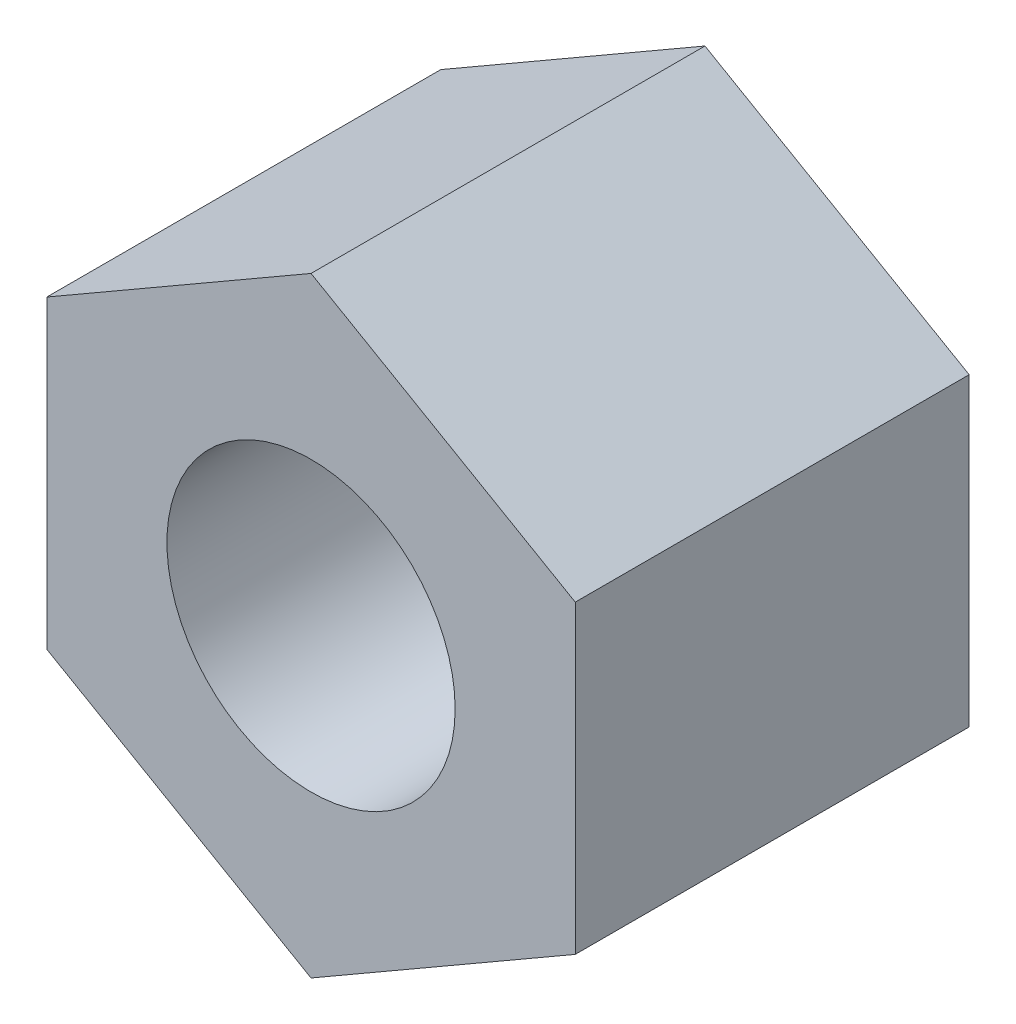
ISO-10303-21;
HEADER;
FILE_DESCRIPTION(('STEP AP214'),'2;1');
FILE_NAME('part.step','',(''),(''),'','','');
FILE_SCHEMA(('AUTOMOTIVE_DESIGN { 1 0 10303 214 1 1 1 1 }'));
ENDSEC;
DATA;
#1=APPLICATION_CONTEXT('core data for automotive mechanical design processes');
#2=APPLICATION_PROTOCOL_DEFINITION('international standard','automotive_design',2000,#1);
#3=PRODUCT_CONTEXT('',#1,'mechanical');
#4=PRODUCT('Part','Part','',(#3));
#5=PRODUCT_RELATED_PRODUCT_CATEGORY('part','',(#4));
#6=PRODUCT_DEFINITION_FORMATION('','',#4);
#7=PRODUCT_DEFINITION_CONTEXT('part definition',#1,'design');
#8=PRODUCT_DEFINITION('design','',#6,#7);
#9=PRODUCT_DEFINITION_SHAPE('','',#8);
#10=(LENGTH_UNIT() NAMED_UNIT(*) SI_UNIT(.MILLI.,.METRE.));
#11=(NAMED_UNIT(*) PLANE_ANGLE_UNIT() SI_UNIT($,.RADIAN.));
#12=(NAMED_UNIT(*) SI_UNIT($,.STERADIAN.) SOLID_ANGLE_UNIT());
#13=UNCERTAINTY_MEASURE_WITH_UNIT(LENGTH_MEASURE(1.E-05),#10,'distance_accuracy_value','');
#14=(GEOMETRIC_REPRESENTATION_CONTEXT(3) GLOBAL_UNCERTAINTY_ASSIGNED_CONTEXT((#13)) GLOBAL_UNIT_ASSIGNED_CONTEXT((#10,
#11,#12)) REPRESENTATION_CONTEXT('',''));
#15=CARTESIAN_POINT('',(0.,0.,0.));
#16=DIRECTION('',(0.,0.,1.));
#17=DIRECTION('',(1.,0.,0.));
#18=AXIS2_PLACEMENT_3D('',#15,#16,#17);
#19=CARTESIAN_POINT('',(0.,0.,4.1));
#20=DIRECTION('',(0.,0.,1.));
#21=DIRECTION('',(1.,0.,0.));
#22=AXIS2_PLACEMENT_3D('',#19,#20,#21);
#23=PLANE('',#22);
#24=DIRECTION('',(0.,1.,0.));
#25=VECTOR('',#24,1.);
#26=CARTESIAN_POINT('',(2.75,-1.58771324027147,4.1));
#27=LINE('',#26,#25);
#28=CARTESIAN_POINT('',(2.75,-1.58771324027147,4.1));
#29=VERTEX_POINT('',#28);
#30=CARTESIAN_POINT('',(2.75,1.58771324027147,4.1));
#31=VERTEX_POINT('',#30);
#32=EDGE_CURVE('E130',#29,#31,#27,.T.);
#33=ORIENTED_EDGE('',*,*,#32,.T.);
#34=DIRECTION('',(-0.866025403784438,0.5,0.));
#35=VECTOR('',#34,1.);
#36=CARTESIAN_POINT('',(2.75,1.58771324027147,4.1));
#37=LINE('',#36,#35);
#38=CARTESIAN_POINT('',(0.,3.17542648054294,4.1));
#39=VERTEX_POINT('',#38);
#40=EDGE_CURVE('E88',#31,#39,#37,.T.);
#41=ORIENTED_EDGE('',*,*,#40,.T.);
#42=DIRECTION('',(-0.866025403784438,-0.5,0.));
#43=VECTOR('',#42,1.);
#44=CARTESIAN_POINT('',(0.,3.17542648054294,4.1));
#45=LINE('',#44,#43);
#46=CARTESIAN_POINT('',(-2.75,1.58771324027147,4.1));
#47=VERTEX_POINT('',#46);
#48=EDGE_CURVE('E101',#39,#47,#45,.T.);
#49=ORIENTED_EDGE('',*,*,#48,.T.);
#50=DIRECTION('',(0.,-1.,0.));
#51=VECTOR('',#50,1.);
#52=CARTESIAN_POINT('',(-2.75,1.58771324027147,4.1));
#53=LINE('',#52,#51);
#54=CARTESIAN_POINT('',(-2.75,-1.58771324027147,4.1));
#55=VERTEX_POINT('',#54);
#56=EDGE_CURVE('E95',#47,#55,#53,.T.);
#57=ORIENTED_EDGE('',*,*,#56,.T.);
#58=DIRECTION('',(0.866025403784439,-0.5,0.));
#59=VECTOR('',#58,1.);
#60=CARTESIAN_POINT('',(-2.75,-1.58771324027147,4.1));
#61=LINE('',#60,#59);
#62=CARTESIAN_POINT('',(0.,-3.17542648054294,4.1));
#63=VERTEX_POINT('',#62);
#64=EDGE_CURVE('E99',#55,#63,#61,.T.);
#65=ORIENTED_EDGE('',*,*,#64,.T.);
#66=DIRECTION('',(0.866025403784438,0.5,0.));
#67=VECTOR('',#66,1.);
#68=CARTESIAN_POINT('',(0.,-3.17542648054294,4.1));
#69=LINE('',#68,#67);
#70=EDGE_CURVE('E51',#63,#29,#69,.T.);
#71=ORIENTED_EDGE('',*,*,#70,.T.);
#72=EDGE_LOOP('',(#33,#41,#49,#57,#65,#71));
#73=FACE_BOUND('',#72,.T.);
#74=CARTESIAN_POINT('',(0.,0.,4.1));
#75=DIRECTION('',(0.,0.,1.));
#76=DIRECTION('',(1.,0.,0.));
#77=AXIS2_PLACEMENT_3D('',#74,#75,#76);
#78=CIRCLE('',#77,1.5);
#79=CARTESIAN_POINT('',(1.5,0.,4.1));
#80=VERTEX_POINT('',#79);
#81=EDGE_CURVE('E123',#80,#80,#78,.T.);
#82=ORIENTED_EDGE('',*,*,#81,.F.);
#83=EDGE_LOOP('',(#82));
#84=FACE_BOUND('',#83,.T.);
#85=ADVANCED_FACE('F34',(#73,#84),#23,.T.);
#86=CARTESIAN_POINT('',(0.,0.,0.));
#87=DIRECTION('',(0.,0.,1.));
#88=DIRECTION('',(1.,0.,0.));
#89=AXIS2_PLACEMENT_3D('',#86,#87,#88);
#90=PLANE('',#89);
#91=DIRECTION('',(0.,1.,0.));
#92=VECTOR('',#91,1.);
#93=CARTESIAN_POINT('',(2.75,-1.58771324027147,0.));
#94=LINE('',#93,#92);
#95=CARTESIAN_POINT('',(2.75,-1.58771324027147,0.));
#96=VERTEX_POINT('',#95);
#97=CARTESIAN_POINT('',(2.75,1.58771324027147,0.));
#98=VERTEX_POINT('',#97);
#99=EDGE_CURVE('E119',#96,#98,#94,.T.);
#100=ORIENTED_EDGE('',*,*,#99,.F.);
#101=DIRECTION('',(0.866025403784438,0.5,0.));
#102=VECTOR('',#101,1.);
#103=CARTESIAN_POINT('',(0.,-3.17542648054294,0.));
#104=LINE('',#103,#102);
#105=CARTESIAN_POINT('',(0.,-3.17542648054294,0.));
#106=VERTEX_POINT('',#105);
#107=EDGE_CURVE('E80',#106,#96,#104,.T.);
#108=ORIENTED_EDGE('',*,*,#107,.F.);
#109=DIRECTION('',(0.866025403784439,-0.5,0.));
#110=VECTOR('',#109,1.);
#111=CARTESIAN_POINT('',(-2.75,-1.58771324027147,0.));
#112=LINE('',#111,#110);
#113=CARTESIAN_POINT('',(-2.75,-1.58771324027147,0.));
#114=VERTEX_POINT('',#113);
#115=EDGE_CURVE('E74',#114,#106,#112,.T.);
#116=ORIENTED_EDGE('',*,*,#115,.F.);
#117=DIRECTION('',(0.,-1.,0.));
#118=VECTOR('',#117,1.);
#119=CARTESIAN_POINT('',(-2.75,1.58771324027147,0.));
#120=LINE('',#119,#118);
#121=CARTESIAN_POINT('',(-2.75,1.58771324027147,0.));
#122=VERTEX_POINT('',#121);
#123=EDGE_CURVE('E109',#122,#114,#120,.T.);
#124=ORIENTED_EDGE('',*,*,#123,.F.);
#125=DIRECTION('',(-0.866025403784438,-0.5,0.));
#126=VECTOR('',#125,1.);
#127=CARTESIAN_POINT('',(0.,3.17542648054294,0.));
#128=LINE('',#127,#126);
#129=CARTESIAN_POINT('',(0.,3.17542648054294,0.));
#130=VERTEX_POINT('',#129);
#131=EDGE_CURVE('E125',#130,#122,#128,.T.);
#132=ORIENTED_EDGE('',*,*,#131,.F.);
#133=DIRECTION('',(-0.866025403784438,0.5,0.));
#134=VECTOR('',#133,1.);
#135=CARTESIAN_POINT('',(2.75,1.58771324027147,0.));
#136=LINE('',#135,#134);
#137=EDGE_CURVE('E122',#98,#130,#136,.T.);
#138=ORIENTED_EDGE('',*,*,#137,.F.);
#139=EDGE_LOOP('',(#100,#108,#116,#124,#132,#138));
#140=FACE_BOUND('',#139,.T.);
#141=CARTESIAN_POINT('',(0.,0.,0.));
#142=DIRECTION('',(0.,0.,1.));
#143=DIRECTION('',(1.,0.,0.));
#144=AXIS2_PLACEMENT_3D('',#141,#142,#143);
#145=CIRCLE('',#144,1.5);
#146=CARTESIAN_POINT('',(1.5,0.,0.));
#147=VERTEX_POINT('',#146);
#148=EDGE_CURVE('E223',#147,#147,#145,.T.);
#149=ORIENTED_EDGE('',*,*,#148,.T.);
#150=EDGE_LOOP('',(#149));
#151=FACE_BOUND('',#150,.T.);
#152=ADVANCED_FACE('F139',(#140,#151),#90,.F.);
#153=CARTESIAN_POINT('',(2.75,-1.58771324027147,4.1));
#154=DIRECTION('',(-1.,0.,0.));
#155=DIRECTION('',(0.,0.,1.));
#156=AXIS2_PLACEMENT_3D('',#153,#154,#155);
#157=PLANE('',#156);
#158=ORIENTED_EDGE('',*,*,#99,.T.);
#159=DIRECTION('',(0.,0.,-1.));
#160=VECTOR('',#159,1.);
#161=CARTESIAN_POINT('',(2.75,1.58771324027147,4.1));
#162=LINE('',#161,#160);
#163=EDGE_CURVE('E11',#31,#98,#162,.T.);
#164=ORIENTED_EDGE('',*,*,#163,.F.);
#165=ORIENTED_EDGE('',*,*,#32,.F.);
#166=DIRECTION('',(0.,0.,-1.));
#167=VECTOR('',#166,1.);
#168=CARTESIAN_POINT('',(2.75,-1.58771324027147,4.1));
#169=LINE('',#168,#167);
#170=EDGE_CURVE('E115',#29,#96,#169,.T.);
#171=ORIENTED_EDGE('',*,*,#170,.T.);
#172=EDGE_LOOP('',(#158,#164,#165,#171));
#173=FACE_BOUND('',#172,.T.);
#174=ADVANCED_FACE('F36',(#173),#157,.F.);
#175=CARTESIAN_POINT('',(2.75,1.58771324027147,4.1));
#176=DIRECTION('',(-0.5,-0.866025403784439,0.));
#177=DIRECTION('',(0.866025403784439,-0.5,0.));
#178=AXIS2_PLACEMENT_3D('',#175,#176,#177);
#179=PLANE('',#178);
#180=ORIENTED_EDGE('',*,*,#137,.T.);
#181=DIRECTION('',(0.,0.,-1.));
#182=VECTOR('',#181,1.);
#183=CARTESIAN_POINT('',(0.,3.17542648054294,4.1));
#184=LINE('',#183,#182);
#185=EDGE_CURVE('E43',#39,#130,#184,.T.);
#186=ORIENTED_EDGE('',*,*,#185,.F.);
#187=ORIENTED_EDGE('',*,*,#40,.F.);
#188=ORIENTED_EDGE('',*,*,#163,.T.);
#189=EDGE_LOOP('',(#180,#186,#187,#188));
#190=FACE_BOUND('',#189,.T.);
#191=ADVANCED_FACE('F164',(#190),#179,.F.);
#192=CARTESIAN_POINT('',(0.,3.17542648054294,4.1));
#193=DIRECTION('',(0.5,-0.866025403784438,0.));
#194=DIRECTION('',(0.866025403784439,0.5,0.));
#195=AXIS2_PLACEMENT_3D('',#192,#193,#194);
#196=PLANE('',#195);
#197=ORIENTED_EDGE('',*,*,#131,.T.);
#198=DIRECTION('',(0.,0.,-1.));
#199=VECTOR('',#198,1.);
#200=CARTESIAN_POINT('',(-2.75,1.58771324027147,4.1));
#201=LINE('',#200,#199);
#202=EDGE_CURVE('E110',#47,#122,#201,.T.);
#203=ORIENTED_EDGE('',*,*,#202,.F.);
#204=ORIENTED_EDGE('',*,*,#48,.F.);
#205=ORIENTED_EDGE('',*,*,#185,.T.);
#206=EDGE_LOOP('',(#197,#203,#204,#205));
#207=FACE_BOUND('',#206,.T.);
#208=ADVANCED_FACE('F136',(#207),#196,.F.);
#209=CARTESIAN_POINT('',(-2.75,1.58771324027147,4.1));
#210=DIRECTION('',(1.,0.,0.));
#211=DIRECTION('',(0.,0.,-1.));
#212=AXIS2_PLACEMENT_3D('',#209,#210,#211);
#213=PLANE('',#212);
#214=ORIENTED_EDGE('',*,*,#123,.T.);
#215=DIRECTION('',(0.,0.,-1.));
#216=VECTOR('',#215,1.);
#217=CARTESIAN_POINT('',(-2.75,-1.58771324027147,4.1));
#218=LINE('',#217,#216);
#219=EDGE_CURVE('E106',#55,#114,#218,.T.);
#220=ORIENTED_EDGE('',*,*,#219,.F.);
#221=ORIENTED_EDGE('',*,*,#56,.F.);
#222=ORIENTED_EDGE('',*,*,#202,.T.);
#223=EDGE_LOOP('',(#214,#220,#221,#222));
#224=FACE_BOUND('',#223,.T.);
#225=ADVANCED_FACE('F107',(#224),#213,.F.);
#226=CARTESIAN_POINT('',(-2.75,-1.58771324027147,4.1));
#227=DIRECTION('',(0.5,0.866025403784439,0.));
#228=DIRECTION('',(-0.866025403784439,0.5,0.));
#229=AXIS2_PLACEMENT_3D('',#226,#227,#228);
#230=PLANE('',#229);
#231=ORIENTED_EDGE('',*,*,#115,.T.);
#232=DIRECTION('',(0.,0.,-1.));
#233=VECTOR('',#232,1.);
#234=CARTESIAN_POINT('',(0.,-3.17542648054294,4.1));
#235=LINE('',#234,#233);
#236=EDGE_CURVE('E111',#63,#106,#235,.T.);
#237=ORIENTED_EDGE('',*,*,#236,.F.);
#238=ORIENTED_EDGE('',*,*,#64,.F.);
#239=ORIENTED_EDGE('',*,*,#219,.T.);
#240=EDGE_LOOP('',(#231,#237,#238,#239));
#241=FACE_BOUND('',#240,.T.);
#242=ADVANCED_FACE('F113',(#241),#230,.F.);
#243=CARTESIAN_POINT('',(0.,-3.17542648054294,4.1));
#244=DIRECTION('',(-0.5,0.866025403784438,0.));
#245=DIRECTION('',(-0.866025403784439,-0.5,0.));
#246=AXIS2_PLACEMENT_3D('',#243,#244,#245);
#247=PLANE('',#246);
#248=ORIENTED_EDGE('',*,*,#107,.T.);
#249=ORIENTED_EDGE('',*,*,#170,.F.);
#250=ORIENTED_EDGE('',*,*,#70,.F.);
#251=ORIENTED_EDGE('',*,*,#236,.T.);
#252=EDGE_LOOP('',(#248,#249,#250,#251));
#253=FACE_BOUND('',#252,.T.);
#254=ADVANCED_FACE('F144',(#253),#247,.F.);
#255=CARTESIAN_POINT('',(0.,0.,4.1));
#256=DIRECTION('',(0.,0.,-1.));
#257=DIRECTION('',(-1.,0.,0.));
#258=AXIS2_PLACEMENT_3D('',#255,#256,#257);
#259=CYLINDRICAL_SURFACE('',#258,1.5);
#260=ORIENTED_EDGE('',*,*,#81,.T.);
#261=EDGE_LOOP('',(#260));
#262=FACE_BOUND('',#261,.T.);
#263=ORIENTED_EDGE('',*,*,#148,.F.);
#264=EDGE_LOOP('',(#263));
#265=FACE_BOUND('',#264,.T.);
#266=ADVANCED_FACE('F146',(#262,#265),#259,.F.);
#267=CLOSED_SHELL('',(#85,#152,#174,#191,#208,#225,#242,#254,#266));
#268=MANIFOLD_SOLID_BREP('B2',#267);
#269=ADVANCED_BREP_SHAPE_REPRESENTATION('',(#18,#268),#14);
#270=SHAPE_DEFINITION_REPRESENTATION(#9,#269);
ENDSEC;
END-ISO-10303-21;
